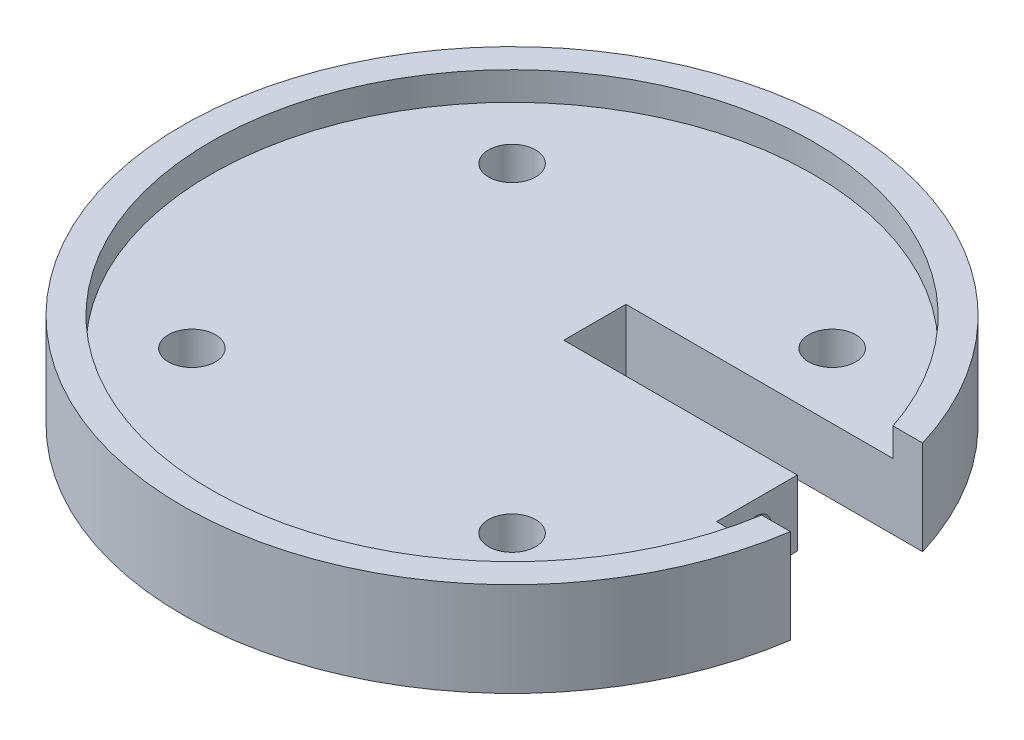
ISO-10303-21;
HEADER;
FILE_DESCRIPTION(('STEP AP214'),'2;1');
FILE_NAME('part.step','',(''),(''),'','','');
FILE_SCHEMA(('AUTOMOTIVE_DESIGN { 1 0 10303 214 1 1 1 1 }'));
ENDSEC;
DATA;
#1=APPLICATION_CONTEXT('core data for automotive mechanical design processes');
#2=APPLICATION_PROTOCOL_DEFINITION('international standard','automotive_design',2000,#1);
#3=PRODUCT_CONTEXT('',#1,'mechanical');
#4=PRODUCT('Part','Part','',(#3));
#5=PRODUCT_RELATED_PRODUCT_CATEGORY('part','',(#4));
#6=PRODUCT_DEFINITION_FORMATION('','',#4);
#7=PRODUCT_DEFINITION_CONTEXT('part definition',#1,'design');
#8=PRODUCT_DEFINITION('design','',#6,#7);
#9=PRODUCT_DEFINITION_SHAPE('','',#8);
#10=(LENGTH_UNIT() NAMED_UNIT(*) SI_UNIT(.MILLI.,.METRE.));
#11=(NAMED_UNIT(*) PLANE_ANGLE_UNIT() SI_UNIT($,.RADIAN.));
#12=(NAMED_UNIT(*) SI_UNIT($,.STERADIAN.) SOLID_ANGLE_UNIT());
#13=UNCERTAINTY_MEASURE_WITH_UNIT(LENGTH_MEASURE(1.E-05),#10,'distance_accuracy_value','');
#14=(GEOMETRIC_REPRESENTATION_CONTEXT(3) GLOBAL_UNCERTAINTY_ASSIGNED_CONTEXT((#13)) GLOBAL_UNIT_ASSIGNED_CONTEXT((#10,
#11,#12)) REPRESENTATION_CONTEXT('',''));
#15=CARTESIAN_POINT('',(0.,0.,0.));
#16=DIRECTION('',(0.,0.,1.));
#17=DIRECTION('',(1.,0.,0.));
#18=AXIS2_PLACEMENT_3D('',#15,#16,#17);
#19=CARTESIAN_POINT('',(26.8023269621628,0.,-3.49209607444166));
#20=DIRECTION('',(-1.,0.,0.));
#21=DIRECTION('',(0.,0.,1.));
#22=AXIS2_PLACEMENT_3D('',#19,#20,#21);
#23=PLANE('',#22);
#24=CARTESIAN_POINT('',(26.8023269621628,3.80105562241668,0.847360281370512));
#25=DIRECTION('',(1.,0.,0.));
#26=DIRECTION('',(0.,0.,-1.));
#27=AXIS2_PLACEMENT_3D('',#24,#25,#26);
#28=CIRCLE('',#27,1.6);
#29=CARTESIAN_POINT('',(26.8023269621628,3.80105562241668,-0.752639718629488));
#30=VERTEX_POINT('',#29);
#31=EDGE_CURVE('E137',#30,#30,#28,.T.);
#32=ORIENTED_EDGE('',*,*,#31,.F.);
#33=EDGE_LOOP('',(#32));
#34=FACE_BOUND('',#33,.T.);
#35=DIRECTION('',(0.,0.,-1.));
#36=VECTOR('',#35,1.);
#37=CARTESIAN_POINT('',(26.8023269621628,7.,-3.49209607444166));
#38=LINE('',#37,#36);
#39=CARTESIAN_POINT('',(26.8023269621628,7.,5.08084170476093));
#40=VERTEX_POINT('',#39);
#41=CARTESIAN_POINT('',(26.8023269621628,7.,-3.49209607444166));
#42=VERTEX_POINT('',#41);
#43=EDGE_CURVE('E154',#40,#42,#38,.T.);
#44=ORIENTED_EDGE('',*,*,#43,.F.);
#45=DIRECTION('',(0.,1.,0.));
#46=VECTOR('',#45,1.);
#47=CARTESIAN_POINT('',(26.8023269621628,0.,5.08084170476093));
#48=LINE('',#47,#46);
#49=CARTESIAN_POINT('',(26.8023269621628,0.,5.08084170476093));
#50=VERTEX_POINT('',#49);
#51=EDGE_CURVE('E175',#50,#40,#48,.T.);
#52=ORIENTED_EDGE('',*,*,#51,.F.);
#53=DIRECTION('',(0.,0.,1.));
#54=VECTOR('',#53,1.);
#55=CARTESIAN_POINT('',(26.8023269621628,0.,-3.49209607444166));
#56=LINE('',#55,#54);
#57=CARTESIAN_POINT('',(26.8023269621628,0.,-3.49209607444166));
#58=VERTEX_POINT('',#57);
#59=EDGE_CURVE('E170',#58,#50,#56,.T.);
#60=ORIENTED_EDGE('',*,*,#59,.F.);
#61=DIRECTION('',(0.,1.,0.));
#62=VECTOR('',#61,1.);
#63=CARTESIAN_POINT('',(26.8023269621628,0.,-3.49209607444166));
#64=LINE('',#63,#62);
#65=EDGE_CURVE('E112',#58,#42,#64,.T.);
#66=ORIENTED_EDGE('',*,*,#65,.T.);
#67=EDGE_LOOP('',(#44,#52,#60,#66));
#68=FACE_BOUND('',#67,.T.);
#69=ADVANCED_FACE('F33',(#34,#68),#23,.F.);
#70=CARTESIAN_POINT('',(-17.,0.,-17.));
#71=DIRECTION('',(0.,1.,0.));
#72=DIRECTION('',(0.,0.,1.));
#73=AXIS2_PLACEMENT_3D('',#70,#71,#72);
#74=CYLINDRICAL_SURFACE('',#73,2.5);
#75=CARTESIAN_POINT('',(-17.,0.,-17.));
#76=DIRECTION('',(0.,1.,0.));
#77=DIRECTION('',(0.,0.,1.));
#78=AXIS2_PLACEMENT_3D('',#75,#76,#77);
#79=CIRCLE('',#78,2.5);
#80=CARTESIAN_POINT('',(-17.,0.,-14.5));
#81=VERTEX_POINT('',#80);
#82=EDGE_CURVE('E166',#81,#81,#79,.T.);
#83=ORIENTED_EDGE('',*,*,#82,.F.);
#84=EDGE_LOOP('',(#83));
#85=FACE_BOUND('',#84,.T.);
#86=CARTESIAN_POINT('',(-17.,7.,-17.));
#87=DIRECTION('',(0.,1.,0.));
#88=DIRECTION('',(0.,0.,1.));
#89=AXIS2_PLACEMENT_3D('',#86,#87,#88);
#90=CIRCLE('',#89,2.5);
#91=CARTESIAN_POINT('',(-17.,7.,-14.5));
#92=VERTEX_POINT('',#91);
#93=EDGE_CURVE('E151',#92,#92,#90,.F.);
#94=ORIENTED_EDGE('',*,*,#93,.F.);
#95=EDGE_LOOP('',(#94));
#96=FACE_BOUND('',#95,.T.);
#97=ADVANCED_FACE('F236',(#85,#96),#74,.F.);
#98=CARTESIAN_POINT('',(17.,10.,-17.));
#99=DIRECTION('',(0.,-1.,0.));
#100=DIRECTION('',(0.,0.,-1.));
#101=AXIS2_PLACEMENT_3D('',#98,#99,#100);
#102=CYLINDRICAL_SURFACE('',#101,2.5);
#103=CARTESIAN_POINT('',(17.,0.,-17.));
#104=DIRECTION('',(0.,-1.,0.));
#105=DIRECTION('',(0.,0.,-1.));
#106=AXIS2_PLACEMENT_3D('',#103,#104,#105);
#107=CIRCLE('',#106,2.5);
#108=CARTESIAN_POINT('',(17.,0.,-19.5));
#109=VERTEX_POINT('',#108);
#110=EDGE_CURVE('E163',#109,#109,#107,.T.);
#111=ORIENTED_EDGE('',*,*,#110,.T.);
#112=EDGE_LOOP('',(#111));
#113=FACE_BOUND('',#112,.T.);
#114=CARTESIAN_POINT('',(17.,7.,-17.));
#115=DIRECTION('',(0.,1.,0.));
#116=DIRECTION('',(0.,0.,1.));
#117=AXIS2_PLACEMENT_3D('',#114,#115,#116);
#118=CIRCLE('',#117,2.5);
#119=CARTESIAN_POINT('',(17.,7.,-14.5));
#120=VERTEX_POINT('',#119);
#121=EDGE_CURVE('E148',#120,#120,#118,.F.);
#122=ORIENTED_EDGE('',*,*,#121,.F.);
#123=EDGE_LOOP('',(#122));
#124=FACE_BOUND('',#123,.T.);
#125=ADVANCED_FACE('F232',(#113,#124),#102,.F.);
#126=CARTESIAN_POINT('',(-17.,10.,17.));
#127=DIRECTION('',(0.,-1.,0.));
#128=DIRECTION('',(0.,0.,-1.));
#129=AXIS2_PLACEMENT_3D('',#126,#127,#128);
#130=CYLINDRICAL_SURFACE('',#129,2.5);
#131=CARTESIAN_POINT('',(-17.,0.,17.));
#132=DIRECTION('',(0.,-1.,0.));
#133=DIRECTION('',(0.,0.,-1.));
#134=AXIS2_PLACEMENT_3D('',#131,#132,#133);
#135=CIRCLE('',#134,2.5);
#136=CARTESIAN_POINT('',(-17.,0.,14.5));
#137=VERTEX_POINT('',#136);
#138=EDGE_CURVE('E160',#137,#137,#135,.T.);
#139=ORIENTED_EDGE('',*,*,#138,.T.);
#140=EDGE_LOOP('',(#139));
#141=FACE_BOUND('',#140,.T.);
#142=CARTESIAN_POINT('',(-17.,7.,17.));
#143=DIRECTION('',(0.,1.,0.));
#144=DIRECTION('',(0.,0.,1.));
#145=AXIS2_PLACEMENT_3D('',#142,#143,#144);
#146=CIRCLE('',#145,2.5);
#147=CARTESIAN_POINT('',(-17.,7.,19.5));
#148=VERTEX_POINT('',#147);
#149=EDGE_CURVE('E145',#148,#148,#146,.F.);
#150=ORIENTED_EDGE('',*,*,#149,.F.);
#151=EDGE_LOOP('',(#150));
#152=FACE_BOUND('',#151,.T.);
#153=ADVANCED_FACE('F228',(#141,#152),#130,.F.);
#154=CARTESIAN_POINT('',(17.,10.,17.));
#155=DIRECTION('',(0.,-1.,0.));
#156=DIRECTION('',(0.,0.,-1.));
#157=AXIS2_PLACEMENT_3D('',#154,#155,#156);
#158=CYLINDRICAL_SURFACE('',#157,2.5);
#159=CARTESIAN_POINT('',(17.,0.,17.));
#160=DIRECTION('',(0.,-1.,0.));
#161=DIRECTION('',(0.,0.,-1.));
#162=AXIS2_PLACEMENT_3D('',#159,#160,#161);
#163=CIRCLE('',#162,2.5);
#164=CARTESIAN_POINT('',(17.,0.,14.5));
#165=VERTEX_POINT('',#164);
#166=EDGE_CURVE('E157',#165,#165,#163,.T.);
#167=ORIENTED_EDGE('',*,*,#166,.T.);
#168=EDGE_LOOP('',(#167));
#169=FACE_BOUND('',#168,.T.);
#170=CARTESIAN_POINT('',(17.,7.,17.));
#171=DIRECTION('',(0.,1.,0.));
#172=DIRECTION('',(0.,0.,1.));
#173=AXIS2_PLACEMENT_3D('',#170,#171,#172);
#174=CIRCLE('',#173,2.5);
#175=CARTESIAN_POINT('',(17.,7.,19.5));
#176=VERTEX_POINT('',#175);
#177=EDGE_CURVE('E143',#176,#176,#174,.F.);
#178=ORIENTED_EDGE('',*,*,#177,.F.);
#179=EDGE_LOOP('',(#178));
#180=FACE_BOUND('',#179,.T.);
#181=ADVANCED_FACE('F225',(#169,#180),#158,.F.);
#182=CARTESIAN_POINT('',(0.,10.,0.));
#183=DIRECTION('',(0.,-1.,0.));
#184=DIRECTION('',(0.,0.,-1.));
#185=AXIS2_PLACEMENT_3D('',#182,#183,#184);
#186=CYLINDRICAL_SURFACE('',#185,35.);
#187=CARTESIAN_POINT('',(-35.,0.923212584036088,0.));
#188=CARTESIAN_POINT('',(-34.9999987113355,0.970770027813447,-0.161490793502893));
#189=CARTESIAN_POINT('',(-34.9988715856203,1.03198490601423,-0.319079757980077));
#190=CARTESIAN_POINT('',(-34.9948040443405,1.18001665800052,-0.621862354062942));
#191=CARTESIAN_POINT('',(-34.9918615485993,1.26686284227518,-0.767041548102503));
#192=CARTESIAN_POINT('',(-34.984792432974,1.46361406353998,-1.0406911563189));
#193=CARTESIAN_POINT('',(-34.9806664688793,1.57350632108003,-1.16917076701597));
#194=CARTESIAN_POINT('',(-34.9719551944163,1.81323723113989,-1.40584814886978));
#195=CARTESIAN_POINT('',(-34.9673699877939,1.9430713821732,-1.51405048501152));
#196=CARTESIAN_POINT('',(-34.9584672800096,2.21927746237046,-1.70732849372381));
#197=CARTESIAN_POINT('',(-34.9541502378551,2.36567659925177,-1.79236531341154));
#198=CARTESIAN_POINT('',(-34.9464533121318,2.67070084002964,-1.93665914358067));
#199=CARTESIAN_POINT('',(-34.9430734571982,2.82932631730591,-1.995915366382));
#200=CARTESIAN_POINT('',(-34.9377562788584,3.15423030570815,-2.08693111434654));
#201=CARTESIAN_POINT('',(-34.9358183414796,3.32050552748937,-2.11870234363781));
#202=CARTESIAN_POINT('',(-34.9336676045346,3.65603987948844,-2.15387693379364));
#203=CARTESIAN_POINT('',(-34.93345478338,3.82529897233897,-2.15728064965495));
#204=CARTESIAN_POINT('',(-34.9347842134457,4.16169710766299,-2.13564137387501));
#205=CARTESIAN_POINT('',(-34.9363235415654,4.32883921212232,-2.11064576079847));
#206=CARTESIAN_POINT('',(-34.9409272924479,4.65654948269462,-2.0330018985213));
#207=CARTESIAN_POINT('',(-34.9439917195039,4.81711763030101,-1.98035357148034));
#208=CARTESIAN_POINT('',(-34.9511939812794,5.1272042791438,-1.84887818344558));
#209=CARTESIAN_POINT('',(-34.9553322639276,5.27671813587399,-1.77004019431718));
#210=CARTESIAN_POINT('',(-34.964054994202,5.56040751354417,-1.58842455541034));
#211=CARTESIAN_POINT('',(-34.9686394480342,5.69458282107499,-1.48564657260905));
#212=CARTESIAN_POINT('',(-34.9775377766643,5.94402474619005,-1.25885549016796));
#213=CARTESIAN_POINT('',(-34.9818511795597,6.05925892130771,-1.13480668500993));
#214=CARTESIAN_POINT('',(-34.9894597779883,6.26727343393734,-0.869100223555232));
#215=CARTESIAN_POINT('',(-34.9927549784068,6.36005387918284,-0.727442651750777));
#216=CARTESIAN_POINT('',(-34.9976650960806,6.52047149326415,-0.430615134186342));
#217=CARTESIAN_POINT('',(-34.9992809426599,6.58812255491282,-0.275452713344209));
#218=CARTESIAN_POINT('',(-35.0003365205888,6.69641636613735,0.044033170950188));
#219=CARTESIAN_POINT('',(-34.9997762948787,6.73705964863759,0.208356453568637));
#220=CARTESIAN_POINT('',(-34.9962122622226,6.79011288676922,0.541034065256287));
#221=CARTESIAN_POINT('',(-34.9932148051419,6.80259589145416,0.709376817222017));
#222=CARTESIAN_POINT('',(-34.9847792818742,6.79921163235153,1.04571393756858));
#223=CARTESIAN_POINT('',(-34.9793412237102,6.7833444617589,1.21370830709283));
#224=CARTESIAN_POINT('',(-34.9662950618867,6.72375593072267,1.54454559675917));
#225=CARTESIAN_POINT('',(-34.9586875339288,6.680041956058,1.70738987083831));
#226=CARTESIAN_POINT('',(-34.9418216189781,6.5660401407258,2.02340363323523));
#227=CARTESIAN_POINT('',(-34.9325631914156,6.49575164696208,2.17657288367136));
#228=CARTESIAN_POINT('',(-34.9130810956507,6.33029792867476,2.4694979947417));
#229=CARTESIAN_POINT('',(-34.9028540473763,6.23504337539846,2.60920317484709));
#230=CARTESIAN_POINT('',(-34.882323963613,6.02245990206357,2.87066269852433));
#231=CARTESIAN_POINT('',(-34.8720209264707,5.90513050033644,2.99241665030075));
#232=CARTESIAN_POINT('',(-34.8522183913902,5.65130942850385,3.21487356670649));
#233=CARTESIAN_POINT('',(-34.8427212788554,5.51476384956449,3.31551525380659));
#234=CARTESIAN_POINT('',(-34.8254342771991,5.22660624502898,3.49242874178454));
#235=CARTESIAN_POINT('',(-34.8176443618568,5.07499445088533,3.56870091695956));
#236=CARTESIAN_POINT('',(-34.8045211223669,4.76140364982748,3.69449901063162));
#237=CARTESIAN_POINT('',(-34.7991815477988,4.59945223467926,3.74409303708652));
#238=CARTESIAN_POINT('',(-34.7914391117942,4.2694536542725,3.81537230525147));
#239=CARTESIAN_POINT('',(-34.7890361406344,4.10140671700881,3.83705858970883));
#240=CARTESIAN_POINT('',(-34.7874025966594,3.76494290642798,3.85184072180262));
#241=CARTESIAN_POINT('',(-34.7881552269656,3.59653274889024,3.84508794620467));
#242=CARTESIAN_POINT('',(-34.7927226567193,3.2632535021302,3.80353500098681));
#243=CARTESIAN_POINT('',(-34.796537436125,3.09838438973892,3.76873501493659));
#244=CARTESIAN_POINT('',(-34.8068608895746,2.77703594995725,3.67216154134135));
#245=CARTESIAN_POINT('',(-34.8133666159292,2.6205476533404,3.61041756444475));
#246=CARTESIAN_POINT('',(-34.8284640174083,2.32014271777481,3.46174095080275));
#247=CARTESIAN_POINT('',(-34.8370557546003,2.17622645307045,3.37480756455107));
#248=CARTESIAN_POINT('',(-34.8555828903795,1.90433112792917,3.1777582393418));
#249=CARTESIAN_POINT('',(-34.8655242960861,1.77642853417348,3.06753735717101));
#250=CARTESIAN_POINT('',(-34.8858295460127,1.54090103980295,2.82726011356559));
#251=CARTESIAN_POINT('',(-34.8961933866016,1.43327596493873,2.69720392259771));
#252=CARTESIAN_POINT('',(-34.9164916868301,1.24090976646656,2.42031529164007));
#253=CARTESIAN_POINT('',(-34.9264242138236,1.15626418233744,2.27341631734475));
#254=CARTESIAN_POINT('',(-34.9449987351661,1.01284077788571,1.96736840612572));
#255=CARTESIAN_POINT('',(-34.9536404403533,0.954068747866063,1.80821673649589));
#256=CARTESIAN_POINT('',(-34.9689751969092,0.864161587279006,1.48234893844686));
#257=CARTESIAN_POINT('',(-34.9756697927502,0.833004511782243,1.31563892740845));
#258=CARTESIAN_POINT('',(-34.9866969583521,0.799214875138458,0.979407642382395));
#259=CARTESIAN_POINT('',(-34.991032255109,0.79654931532531,0.809889848407409));
#260=CARTESIAN_POINT('',(-34.9961132508208,0.815597067729106,0.532853575063793));
#261=CARTESIAN_POINT('',(-34.9975870617595,0.828984731959357,0.424707199610565));
#262=CARTESIAN_POINT('',(-34.9995308508325,0.867415350192123,0.210496651145066));
#263=CARTESIAN_POINT('',(-35.0000008333504,0.892458253295265,0.104432469041795));
#264=CARTESIAN_POINT('',(-35.,0.923212584036088,0.));
#265=B_SPLINE_CURVE_WITH_KNOTS('',3,(#187,#188,#189,#190,#191,#192,#193,#194,#195,#196,#197,
#198,#199,#200,#201,#202,#203,#204,#205,#206,#207,#208,#209,#210,#211,#212,#213,#214,#215,#216,
#217,#218,#219,#220,#221,#222,#223,#224,#225,#226,#227,#228,#229,#230,#231,#232,#233,#234,#235,
#236,#237,#238,#239,#240,#241,#242,#243,#244,#245,#246,#247,#248,#249,#250,#251,#252,#253,#254,
#255,#256,#257,#258,#259,#260,#261,#262,#263,#264),.UNSPECIFIED.,.T.,.F.,(4,2,2,2,2,2,2,2,2,2,2,
2,2,2,2,2,2,2,2,2,2,2,2,2,2,2,2,2,2,2,2,2,2,2,2,2,2,2,4),(0.,0.504645716037534,1.00987076681503,
1.51481639876665,2.01964821632747,2.525321589654,3.03101041184224,3.53648378685276,
4.04195083625835,4.54657585226834,5.05120228876788,5.55603955529032,6.0608838448887,
6.56658402149386,7.07228177168958,7.5776995286396,8.0831073122614,8.58720252989054,
9.09129609042108,9.59525600637546,10.0992283084692,10.6050290456043,11.1108408204849,
11.6181009801707,12.1253533483517,12.6313045060158,13.1372367587277,13.6404794246561,
14.1437187968756,14.6464083696196,15.1491129013362,15.6541330852572,16.1591489292256,
16.6662333428544,17.1734311804694,17.6802255980378,18.1864329863109,18.512777461585,
18.8391205116996),.UNSPECIFIED.);
#266=CARTESIAN_POINT('',(-35.,0.923212584036088,0.));
#267=VERTEX_POINT('',#266);
#268=EDGE_CURVE('E193',#267,#267,#265,.T.);
#269=ORIENTED_EDGE('',*,*,#268,.T.);
#270=EDGE_LOOP('',(#269));
#271=FACE_BOUND('',#270,.T.);
#272=CARTESIAN_POINT('',(0.,10.,0.));
#273=DIRECTION('',(0.,1.,0.));
#274=DIRECTION('',(0.,0.,1.));
#275=AXIS2_PLACEMENT_3D('',#272,#273,#274);
#276=CIRCLE('',#275,35.);
#277=CARTESIAN_POINT('',(33.5134241286121,10.,-10.0920960744417));
#278=VERTEX_POINT('',#277);
#279=CARTESIAN_POINT('',(34.6292513284819,10.,5.08084170476093));
#280=VERTEX_POINT('',#279);
#281=EDGE_CURVE('E185',#278,#280,#276,.T.);
#282=ORIENTED_EDGE('',*,*,#281,.F.);
#283=DIRECTION('',(0.,-1.,0.));
#284=VECTOR('',#283,1.);
#285=CARTESIAN_POINT('',(33.5134241286121,10.,-10.0920960744417));
#286=LINE('',#285,#284);
#287=CARTESIAN_POINT('',(33.5134241286121,0.,-10.0920960744417));
#288=VERTEX_POINT('',#287);
#289=EDGE_CURVE('E128',#278,#288,#286,.T.);
#290=ORIENTED_EDGE('',*,*,#289,.T.);
#291=CARTESIAN_POINT('',(0.,0.,0.));
#292=DIRECTION('',(0.,1.,0.));
#293=DIRECTION('',(0.,0.,1.));
#294=AXIS2_PLACEMENT_3D('',#291,#292,#293);
#295=CIRCLE('',#294,35.);
#296=CARTESIAN_POINT('',(34.6292513284819,0.,5.08084170476093));
#297=VERTEX_POINT('',#296);
#298=EDGE_CURVE('E184',#288,#297,#295,.T.);
#299=ORIENTED_EDGE('',*,*,#298,.T.);
#300=DIRECTION('',(0.,-1.,0.));
#301=VECTOR('',#300,1.);
#302=CARTESIAN_POINT('',(34.6292513284819,10.,5.08084170476093));
#303=LINE('',#302,#301);
#304=EDGE_CURVE('E179',#297,#280,#303,.F.);
#305=ORIENTED_EDGE('',*,*,#304,.T.);
#306=EDGE_LOOP('',(#282,#290,#299,#305));
#307=FACE_BOUND('',#306,.T.);
#308=ADVANCED_FACE('F35',(#271,#307),#186,.T.);
#309=CARTESIAN_POINT('',(0.,10.,0.));
#310=DIRECTION('',(0.,1.,0.));
#311=DIRECTION('',(0.,0.,1.));
#312=AXIS2_PLACEMENT_3D('',#309,#310,#311);
#313=PLANE('',#312);
#314=DIRECTION('',(1.,0.,0.));
#315=VECTOR('',#314,1.);
#316=CARTESIAN_POINT('',(1.99984246285112,10.,-10.0920960744417));
#317=LINE('',#316,#315);
#318=CARTESIAN_POINT('',(30.3669161559787,10.,-10.0920960744417));
#319=VERTEX_POINT('',#318);
#320=EDGE_CURVE('E106',#319,#278,#317,.T.);
#321=ORIENTED_EDGE('',*,*,#320,.T.);
#322=ORIENTED_EDGE('',*,*,#281,.T.);
#323=DIRECTION('',(1.,0.,0.));
#324=VECTOR('',#323,1.);
#325=CARTESIAN_POINT('',(35.2527942016625,10.,5.08084170476093));
#326=LINE('',#325,#324);
#327=CARTESIAN_POINT('',(31.5940666513692,10.,5.08084170476093));
#328=VERTEX_POINT('',#327);
#329=EDGE_CURVE('E169',#328,#280,#326,.T.);
#330=ORIENTED_EDGE('',*,*,#329,.F.);
#331=CARTESIAN_POINT('',(0.,10.,0.));
#332=DIRECTION('',(0.,1.,0.));
#333=DIRECTION('',(0.,0.,1.));
#334=AXIS2_PLACEMENT_3D('',#331,#332,#333);
#335=CIRCLE('',#334,32.);
#336=EDGE_CURVE('E140',#319,#328,#335,.T.);
#337=ORIENTED_EDGE('',*,*,#336,.F.);
#338=EDGE_LOOP('',(#321,#322,#330,#337));
#339=FACE_BOUND('',#338,.T.);
#340=ADVANCED_FACE('F247',(#339),#313,.T.);
#341=CARTESIAN_POINT('',(0.,0.,0.));
#342=DIRECTION('',(0.,1.,0.));
#343=DIRECTION('',(0.,0.,1.));
#344=AXIS2_PLACEMENT_3D('',#341,#342,#343);
#345=PLANE('',#344);
#346=ORIENTED_EDGE('',*,*,#166,.F.);
#347=EDGE_LOOP('',(#346));
#348=FACE_BOUND('',#347,.T.);
#349=ORIENTED_EDGE('',*,*,#138,.F.);
#350=EDGE_LOOP('',(#349));
#351=FACE_BOUND('',#350,.T.);
#352=ORIENTED_EDGE('',*,*,#110,.F.);
#353=EDGE_LOOP('',(#352));
#354=FACE_BOUND('',#353,.T.);
#355=ORIENTED_EDGE('',*,*,#82,.T.);
#356=EDGE_LOOP('',(#355));
#357=FACE_BOUND('',#356,.T.);
#358=ORIENTED_EDGE('',*,*,#298,.F.);
#359=DIRECTION('',(1.,0.,0.));
#360=VECTOR('',#359,1.);
#361=CARTESIAN_POINT('',(39.4719761235933,0.,-10.0920960744417));
#362=LINE('',#361,#360);
#363=CARTESIAN_POINT('',(1.99984246285112,0.,-10.0920960744417));
#364=VERTEX_POINT('',#363);
#365=EDGE_CURVE('E119',#364,#288,#362,.T.);
#366=ORIENTED_EDGE('',*,*,#365,.F.);
#367=DIRECTION('',(0.,0.,-1.));
#368=VECTOR('',#367,1.);
#369=CARTESIAN_POINT('',(1.99984246285112,0.,-3.49209607444166));
#370=LINE('',#369,#368);
#371=CARTESIAN_POINT('',(1.99984246285112,0.,-3.49209607444166));
#372=VERTEX_POINT('',#371);
#373=EDGE_CURVE('E101',#372,#364,#370,.T.);
#374=ORIENTED_EDGE('',*,*,#373,.F.);
#375=DIRECTION('',(-1.,0.,0.));
#376=VECTOR('',#375,1.);
#377=CARTESIAN_POINT('',(26.8023269621628,0.,-3.49209607444166));
#378=LINE('',#377,#376);
#379=EDGE_CURVE('E109',#58,#372,#378,.T.);
#380=ORIENTED_EDGE('',*,*,#379,.F.);
#381=ORIENTED_EDGE('',*,*,#59,.T.);
#382=DIRECTION('',(1.,0.,0.));
#383=VECTOR('',#382,1.);
#384=CARTESIAN_POINT('',(35.2527942016625,0.,5.08084170476093));
#385=LINE('',#384,#383);
#386=EDGE_CURVE('E172',#50,#297,#385,.T.);
#387=ORIENTED_EDGE('',*,*,#386,.T.);
#388=EDGE_LOOP('',(#358,#366,#374,#380,#381,#387));
#389=FACE_BOUND('',#388,.T.);
#390=ADVANCED_FACE('F118',(#348,#351,#354,#357,#389),#345,.F.);
#391=CARTESIAN_POINT('',(35.2527942016625,0.,5.08084170476093));
#392=DIRECTION('',(0.,0.,1.));
#393=DIRECTION('',(1.,0.,0.));
#394=AXIS2_PLACEMENT_3D('',#391,#392,#393);
#395=PLANE('',#394);
#396=DIRECTION('',(-1.,0.,0.));
#397=VECTOR('',#396,1.);
#398=CARTESIAN_POINT('',(35.2527942016625,7.,5.08084170476093));
#399=LINE('',#398,#397);
#400=CARTESIAN_POINT('',(31.5940666513692,7.,5.08084170476093));
#401=VERTEX_POINT('',#400);
#402=EDGE_CURVE('E57',#401,#40,#399,.T.);
#403=ORIENTED_EDGE('',*,*,#402,.F.);
#404=DIRECTION('',(0.,1.,0.));
#405=VECTOR('',#404,1.);
#406=CARTESIAN_POINT('',(31.5940666513692,7.,5.08084170476093));
#407=LINE('',#406,#405);
#408=EDGE_CURVE('E187',#401,#328,#407,.T.);
#409=ORIENTED_EDGE('',*,*,#408,.T.);
#410=ORIENTED_EDGE('',*,*,#329,.T.);
#411=ORIENTED_EDGE('',*,*,#304,.F.);
#412=ORIENTED_EDGE('',*,*,#386,.F.);
#413=ORIENTED_EDGE('',*,*,#51,.T.);
#414=EDGE_LOOP('',(#403,#409,#410,#411,#412,#413));
#415=FACE_BOUND('',#414,.T.);
#416=ADVANCED_FACE('F223',(#415),#395,.F.);
#417=CARTESIAN_POINT('',(0.,7.,0.));
#418=DIRECTION('',(0.,1.,0.));
#419=DIRECTION('',(0.,0.,1.));
#420=AXIS2_PLACEMENT_3D('',#417,#418,#419);
#421=CYLINDRICAL_SURFACE('',#420,32.);
#422=CARTESIAN_POINT('',(0.,7.,0.));
#423=DIRECTION('',(0.,1.,0.));
#424=DIRECTION('',(0.,0.,1.));
#425=AXIS2_PLACEMENT_3D('',#422,#423,#424);
#426=CIRCLE('',#425,32.);
#427=CARTESIAN_POINT('',(30.3669161559787,7.,-10.0920960744417));
#428=VERTEX_POINT('',#427);
#429=EDGE_CURVE('E141',#428,#401,#426,.T.);
#430=ORIENTED_EDGE('',*,*,#429,.F.);
#431=DIRECTION('',(0.,1.,0.));
#432=VECTOR('',#431,1.);
#433=CARTESIAN_POINT('',(30.3669161559787,7.,-10.0920960744417));
#434=LINE('',#433,#432);
#435=EDGE_CURVE('E124',#428,#319,#434,.T.);
#436=ORIENTED_EDGE('',*,*,#435,.T.);
#437=ORIENTED_EDGE('',*,*,#336,.T.);
#438=ORIENTED_EDGE('',*,*,#408,.F.);
#439=EDGE_LOOP('',(#430,#436,#437,#438));
#440=FACE_BOUND('',#439,.T.);
#441=ADVANCED_FACE('F220',(#440),#421,.F.);
#442=CARTESIAN_POINT('',(0.,7.,0.));
#443=DIRECTION('',(0.,1.,0.));
#444=DIRECTION('',(0.,0.,1.));
#445=AXIS2_PLACEMENT_3D('',#442,#443,#444);
#446=PLANE('',#445);
#447=DIRECTION('',(-1.,0.,0.));
#448=VECTOR('',#447,1.);
#449=CARTESIAN_POINT('',(0.,7.,-10.0920960744417));
#450=LINE('',#449,#448);
#451=CARTESIAN_POINT('',(1.99984246285112,7.,-10.0920960744417));
#452=VERTEX_POINT('',#451);
#453=EDGE_CURVE('E11',#428,#452,#450,.T.);
#454=ORIENTED_EDGE('',*,*,#453,.F.);
#455=ORIENTED_EDGE('',*,*,#429,.T.);
#456=ORIENTED_EDGE('',*,*,#402,.T.);
#457=ORIENTED_EDGE('',*,*,#43,.T.);
#458=DIRECTION('',(1.,0.,0.));
#459=VECTOR('',#458,1.);
#460=CARTESIAN_POINT('',(0.,7.,-3.49209607444166));
#461=LINE('',#460,#459);
#462=CARTESIAN_POINT('',(1.99984246285112,7.,-3.49209607444166));
#463=VERTEX_POINT('',#462);
#464=EDGE_CURVE('E200',#463,#42,#461,.T.);
#465=ORIENTED_EDGE('',*,*,#464,.F.);
#466=DIRECTION('',(0.,0.,1.));
#467=VECTOR('',#466,1.);
#468=CARTESIAN_POINT('',(1.99984246285112,7.,0.));
#469=LINE('',#468,#467);
#470=EDGE_CURVE('E42',#452,#463,#469,.T.);
#471=ORIENTED_EDGE('',*,*,#470,.F.);
#472=EDGE_LOOP('',(#454,#455,#456,#457,#465,#471));
#473=FACE_BOUND('',#472,.T.);
#474=ORIENTED_EDGE('',*,*,#93,.T.);
#475=EDGE_LOOP('',(#474));
#476=FACE_BOUND('',#475,.T.);
#477=ORIENTED_EDGE('',*,*,#121,.T.);
#478=EDGE_LOOP('',(#477));
#479=FACE_BOUND('',#478,.T.);
#480=ORIENTED_EDGE('',*,*,#149,.T.);
#481=EDGE_LOOP('',(#480));
#482=FACE_BOUND('',#481,.T.);
#483=ORIENTED_EDGE('',*,*,#177,.T.);
#484=EDGE_LOOP('',(#483));
#485=FACE_BOUND('',#484,.T.);
#486=ADVANCED_FACE('F216',(#473,#476,#479,#482,#485),#446,.T.);
#487=CARTESIAN_POINT('',(-8.19767303783717,3.80105562241668,0.847360281370512));
#488=DIRECTION('',(1.,0.,0.));
#489=DIRECTION('',(0.,0.,-1.));
#490=AXIS2_PLACEMENT_3D('',#487,#488,#489);
#491=CYLINDRICAL_SURFACE('',#490,1.6);
#492=CARTESIAN_POINT('',(-8.19767303783717,3.80105562241668,0.847360281370512));
#493=DIRECTION('',(1.,0.,0.));
#494=DIRECTION('',(0.,0.,-1.));
#495=AXIS2_PLACEMENT_3D('',#492,#493,#494);
#496=CIRCLE('',#495,1.6);
#497=CARTESIAN_POINT('',(-8.19767303783717,3.80105562241668,-0.752639718629488));
#498=VERTEX_POINT('',#497);
#499=EDGE_CURVE('E134',#498,#498,#496,.F.);
#500=ORIENTED_EDGE('',*,*,#499,.T.);
#501=EDGE_LOOP('',(#500));
#502=FACE_BOUND('',#501,.T.);
#503=ORIENTED_EDGE('',*,*,#31,.T.);
#504=EDGE_LOOP('',(#503));
#505=FACE_BOUND('',#504,.T.);
#506=ADVANCED_FACE('F212',(#502,#505),#491,.F.);
#507=CARTESIAN_POINT('',(-8.19767303783717,6.80105562241667,0.847360281370512));
#508=DIRECTION('',(1.,0.,0.));
#509=DIRECTION('',(0.,0.,-1.));
#510=AXIS2_PLACEMENT_3D('',#507,#508,#509);
#511=PLANE('',#510);
#512=CARTESIAN_POINT('',(-8.19767303783716,3.80105562241668,0.847360281370512));
#513=DIRECTION('',(1.,0.,0.));
#514=DIRECTION('',(0.,0.,-1.));
#515=AXIS2_PLACEMENT_3D('',#512,#513,#514);
#516=CIRCLE('',#515,2.99999999999999);
#517=CARTESIAN_POINT('',(-8.19767303783716,3.80105562241668,-2.15263971862948));
#518=VERTEX_POINT('',#517);
#519=EDGE_CURVE('E131',#518,#518,#516,.T.);
#520=ORIENTED_EDGE('',*,*,#519,.F.);
#521=EDGE_LOOP('',(#520));
#522=FACE_BOUND('',#521,.T.);
#523=ORIENTED_EDGE('',*,*,#499,.F.);
#524=EDGE_LOOP('',(#523));
#525=FACE_BOUND('',#524,.T.);
#526=ADVANCED_FACE('F207',(#522,#525),#511,.F.);
#527=CARTESIAN_POINT('',(-8.19767303783717,3.80105562241668,0.847360281370512));
#528=DIRECTION('',(1.,0.,0.));
#529=DIRECTION('',(0.,0.,-1.));
#530=AXIS2_PLACEMENT_3D('',#527,#528,#529);
#531=CYLINDRICAL_SURFACE('',#530,2.99999999999999);
#532=ORIENTED_EDGE('',*,*,#519,.T.);
#533=EDGE_LOOP('',(#532));
#534=FACE_BOUND('',#533,.T.);
#535=ORIENTED_EDGE('',*,*,#268,.F.);
#536=EDGE_LOOP('',(#535));
#537=FACE_BOUND('',#536,.T.);
#538=ADVANCED_FACE('F201',(#534,#537),#531,.F.);
#539=CARTESIAN_POINT('',(39.4719761235933,10.,-10.0920960744417));
#540=DIRECTION('',(0.,0.,-1.));
#541=DIRECTION('',(-1.,0.,0.));
#542=AXIS2_PLACEMENT_3D('',#539,#540,#541);
#543=PLANE('',#542);
#544=ORIENTED_EDGE('',*,*,#320,.F.);
#545=ORIENTED_EDGE('',*,*,#435,.F.);
#546=ORIENTED_EDGE('',*,*,#453,.T.);
#547=DIRECTION('',(0.,-1.,0.));
#548=VECTOR('',#547,1.);
#549=CARTESIAN_POINT('',(1.99984246285112,10.,-10.0920960744417));
#550=LINE('',#549,#548);
#551=EDGE_CURVE('E105',#452,#364,#550,.T.);
#552=ORIENTED_EDGE('',*,*,#551,.T.);
#553=ORIENTED_EDGE('',*,*,#365,.T.);
#554=ORIENTED_EDGE('',*,*,#289,.F.);
#555=EDGE_LOOP('',(#544,#545,#546,#552,#553,#554));
#556=FACE_BOUND('',#555,.T.);
#557=ADVANCED_FACE('F206',(#556),#543,.F.);
#558=CARTESIAN_POINT('',(26.8023269621628,10.,-3.49209607444166));
#559=DIRECTION('',(0.,0.,1.));
#560=DIRECTION('',(1.,0.,0.));
#561=AXIS2_PLACEMENT_3D('',#558,#559,#560);
#562=PLANE('',#561);
#563=ORIENTED_EDGE('',*,*,#379,.T.);
#564=DIRECTION('',(0.,-1.,0.));
#565=VECTOR('',#564,1.);
#566=CARTESIAN_POINT('',(1.99984246285112,10.,-3.49209607444166));
#567=LINE('',#566,#565);
#568=EDGE_CURVE('E49',#463,#372,#567,.T.);
#569=ORIENTED_EDGE('',*,*,#568,.F.);
#570=ORIENTED_EDGE('',*,*,#464,.T.);
#571=ORIENTED_EDGE('',*,*,#65,.F.);
#572=EDGE_LOOP('',(#563,#569,#570,#571));
#573=FACE_BOUND('',#572,.T.);
#574=ADVANCED_FACE('F110',(#573),#562,.F.);
#575=CARTESIAN_POINT('',(1.99984246285112,10.,-3.49209607444166));
#576=DIRECTION('',(-1.,0.,0.));
#577=DIRECTION('',(0.,0.,1.));
#578=AXIS2_PLACEMENT_3D('',#575,#576,#577);
#579=PLANE('',#578);
#580=ORIENTED_EDGE('',*,*,#470,.T.);
#581=ORIENTED_EDGE('',*,*,#568,.T.);
#582=ORIENTED_EDGE('',*,*,#373,.T.);
#583=ORIENTED_EDGE('',*,*,#551,.F.);
#584=EDGE_LOOP('',(#580,#581,#582,#583));
#585=FACE_BOUND('',#584,.T.);
#586=ADVANCED_FACE('F98',(#585),#579,.F.);
#587=CLOSED_SHELL('',(#69,#97,#125,#153,#181,#308,#340,#390,#416,#441,#486,#506,#526,#538,#557,
#574,#586));
#588=MANIFOLD_SOLID_BREP('B2',#587);
#589=ADVANCED_BREP_SHAPE_REPRESENTATION('',(#18,#588),#14);
#590=SHAPE_DEFINITION_REPRESENTATION(#9,#589);
ENDSEC;
END-ISO-10303-21;
